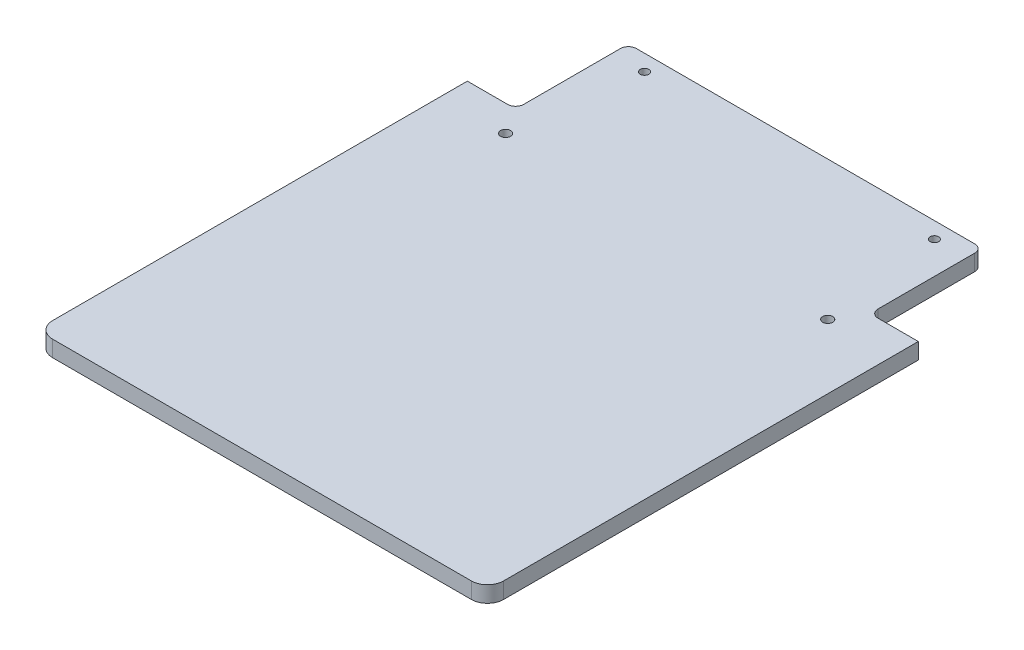
ISO-10303-21;
HEADER;
FILE_DESCRIPTION(('STEP AP214'),'2;1');
FILE_NAME('part.step','',(''),(''),'','','');
FILE_SCHEMA(('AUTOMOTIVE_DESIGN { 1 0 10303 214 1 1 1 1 }'));
ENDSEC;
DATA;
#1=APPLICATION_CONTEXT('core data for automotive mechanical design processes');
#2=APPLICATION_PROTOCOL_DEFINITION('international standard','automotive_design',2000,#1);
#3=PRODUCT_CONTEXT('',#1,'mechanical');
#4=PRODUCT('Part','Part','',(#3));
#5=PRODUCT_RELATED_PRODUCT_CATEGORY('part','',(#4));
#6=PRODUCT_DEFINITION_FORMATION('','',#4);
#7=PRODUCT_DEFINITION_CONTEXT('part definition',#1,'design');
#8=PRODUCT_DEFINITION('design','',#6,#7);
#9=PRODUCT_DEFINITION_SHAPE('','',#8);
#10=(LENGTH_UNIT() NAMED_UNIT(*) SI_UNIT(.MILLI.,.METRE.));
#11=(NAMED_UNIT(*) PLANE_ANGLE_UNIT() SI_UNIT($,.RADIAN.));
#12=(NAMED_UNIT(*) SI_UNIT($,.STERADIAN.) SOLID_ANGLE_UNIT());
#13=UNCERTAINTY_MEASURE_WITH_UNIT(LENGTH_MEASURE(1.E-05),#10,'distance_accuracy_value','');
#14=(GEOMETRIC_REPRESENTATION_CONTEXT(3) GLOBAL_UNCERTAINTY_ASSIGNED_CONTEXT((#13)) GLOBAL_UNIT_ASSIGNED_CONTEXT((#10,
#11,#12)) REPRESENTATION_CONTEXT('',''));
#15=CARTESIAN_POINT('',(0.,0.,0.));
#16=DIRECTION('',(0.,0.,1.));
#17=DIRECTION('',(1.,0.,0.));
#18=AXIS2_PLACEMENT_3D('',#15,#16,#17);
#19=CARTESIAN_POINT('',(0.,12.7,0.));
#20=DIRECTION('',(1.,0.,0.));
#21=DIRECTION('',(0.,0.,-1.));
#22=AXIS2_PLACEMENT_3D('',#19,#20,#21);
#23=PLANE('',#22);
#24=DIRECTION('',(0.,0.,1.));
#25=VECTOR('',#24,1.);
#26=CARTESIAN_POINT('',(0.,12.7,0.));
#27=LINE('',#26,#25);
#28=CARTESIAN_POINT('',(0.,12.7,-339.725));
#29=VERTEX_POINT('',#28);
#30=CARTESIAN_POINT('',(0.,12.7,-12.7));
#31=VERTEX_POINT('',#30);
#32=EDGE_CURVE('E149',#29,#31,#27,.T.);
#33=ORIENTED_EDGE('',*,*,#32,.F.);
#34=DIRECTION('',(0.,1.,0.));
#35=VECTOR('',#34,1.);
#36=CARTESIAN_POINT('',(0.,0.,-339.725));
#37=LINE('',#36,#35);
#38=CARTESIAN_POINT('',(0.,0.,-339.725));
#39=VERTEX_POINT('',#38);
#40=EDGE_CURVE('E137',#39,#29,#37,.T.);
#41=ORIENTED_EDGE('',*,*,#40,.F.);
#42=DIRECTION('',(0.,0.,1.));
#43=VECTOR('',#42,1.);
#44=CARTESIAN_POINT('',(0.,0.,0.));
#45=LINE('',#44,#43);
#46=CARTESIAN_POINT('',(0.,0.,-12.7));
#47=VERTEX_POINT('',#46);
#48=EDGE_CURVE('E147',#39,#47,#45,.T.);
#49=ORIENTED_EDGE('',*,*,#48,.T.);
#50=DIRECTION('',(0.,-1.,0.));
#51=VECTOR('',#50,1.);
#52=CARTESIAN_POINT('',(0.,12.7,-12.7));
#53=LINE('',#52,#51);
#54=EDGE_CURVE('E185',#47,#31,#53,.F.);
#55=ORIENTED_EDGE('',*,*,#54,.T.);
#56=EDGE_LOOP('',(#33,#41,#49,#55));
#57=FACE_BOUND('',#56,.T.);
#58=ADVANCED_FACE('F35',(#57),#23,.F.);
#59=CARTESIAN_POINT('',(0.,12.7,0.));
#60=DIRECTION('',(0.,0.,-1.));
#61=DIRECTION('',(-1.,0.,0.));
#62=AXIS2_PLACEMENT_3D('',#59,#60,#61);
#63=PLANE('',#62);
#64=DIRECTION('',(1.,0.,0.));
#65=VECTOR('',#64,1.);
#66=CARTESIAN_POINT('',(0.,0.,0.));
#67=LINE('',#66,#65);
#68=CARTESIAN_POINT('',(12.7,0.,0.));
#69=VERTEX_POINT('',#68);
#70=CARTESIAN_POINT('',(342.9,0.,0.));
#71=VERTEX_POINT('',#70);
#72=EDGE_CURVE('E156',#69,#71,#67,.T.);
#73=ORIENTED_EDGE('',*,*,#72,.T.);
#74=DIRECTION('',(0.,-1.,0.));
#75=VECTOR('',#74,1.);
#76=CARTESIAN_POINT('',(342.9,12.7,0.));
#77=LINE('',#76,#75);
#78=CARTESIAN_POINT('',(342.9,12.7,0.));
#79=VERTEX_POINT('',#78);
#80=EDGE_CURVE('E179',#71,#79,#77,.F.);
#81=ORIENTED_EDGE('',*,*,#80,.T.);
#82=DIRECTION('',(1.,0.,0.));
#83=VECTOR('',#82,1.);
#84=CARTESIAN_POINT('',(0.,12.7,0.));
#85=LINE('',#84,#83);
#86=CARTESIAN_POINT('',(12.7,12.7,0.));
#87=VERTEX_POINT('',#86);
#88=EDGE_CURVE('E249',#87,#79,#85,.T.);
#89=ORIENTED_EDGE('',*,*,#88,.F.);
#90=DIRECTION('',(0.,-1.,0.));
#91=VECTOR('',#90,1.);
#92=CARTESIAN_POINT('',(12.7,12.7,0.));
#93=LINE('',#92,#91);
#94=EDGE_CURVE('E176',#87,#69,#93,.T.);
#95=ORIENTED_EDGE('',*,*,#94,.T.);
#96=EDGE_LOOP('',(#73,#81,#89,#95));
#97=FACE_BOUND('',#96,.T.);
#98=ADVANCED_FACE('F285',(#97),#63,.F.);
#99=CARTESIAN_POINT('',(355.6,12.7,0.));
#100=DIRECTION('',(-1.,0.,0.));
#101=DIRECTION('',(0.,0.,1.));
#102=AXIS2_PLACEMENT_3D('',#99,#100,#101);
#103=PLANE('',#102);
#104=DIRECTION('',(0.,0.,-1.));
#105=VECTOR('',#104,1.);
#106=CARTESIAN_POINT('',(355.6,0.,0.));
#107=LINE('',#106,#105);
#108=CARTESIAN_POINT('',(355.6,0.,-12.7));
#109=VERTEX_POINT('',#108);
#110=CARTESIAN_POINT('',(355.6,0.,-339.725));
#111=VERTEX_POINT('',#110);
#112=EDGE_CURVE('E159',#109,#111,#107,.T.);
#113=ORIENTED_EDGE('',*,*,#112,.T.);
#114=DIRECTION('',(0.,1.,0.));
#115=VECTOR('',#114,1.);
#116=CARTESIAN_POINT('',(355.6,0.,-339.725));
#117=LINE('',#116,#115);
#118=CARTESIAN_POINT('',(355.6,12.7,-339.725));
#119=VERTEX_POINT('',#118);
#120=EDGE_CURVE('E224',#111,#119,#117,.T.);
#121=ORIENTED_EDGE('',*,*,#120,.T.);
#122=DIRECTION('',(0.,0.,-1.));
#123=VECTOR('',#122,1.);
#124=CARTESIAN_POINT('',(355.6,12.7,0.));
#125=LINE('',#124,#123);
#126=CARTESIAN_POINT('',(355.6,12.7,-12.7));
#127=VERTEX_POINT('',#126);
#128=EDGE_CURVE('E251',#127,#119,#125,.T.);
#129=ORIENTED_EDGE('',*,*,#128,.F.);
#130=DIRECTION('',(0.,-1.,0.));
#131=VECTOR('',#130,1.);
#132=CARTESIAN_POINT('',(355.6,12.7,-12.7));
#133=LINE('',#132,#131);
#134=EDGE_CURVE('E170',#127,#109,#133,.T.);
#135=ORIENTED_EDGE('',*,*,#134,.T.);
#136=EDGE_LOOP('',(#113,#121,#129,#135));
#137=FACE_BOUND('',#136,.T.);
#138=ADVANCED_FACE('F277',(#137),#103,.F.);
#139=CARTESIAN_POINT('',(0.,12.7,-428.625));
#140=DIRECTION('',(0.,0.,1.));
#141=DIRECTION('',(1.,0.,0.));
#142=AXIS2_PLACEMENT_3D('',#139,#140,#141);
#143=PLANE('',#142);
#144=DIRECTION('',(-1.,0.,0.));
#145=VECTOR('',#144,1.);
#146=CARTESIAN_POINT('',(0.,12.7,-428.625));
#147=LINE('',#146,#145);
#148=CARTESIAN_POINT('',(311.15,12.7,-428.625));
#149=VERTEX_POINT('',#148);
#150=CARTESIAN_POINT('',(44.45,12.7,-428.625));
#151=VERTEX_POINT('',#150);
#152=EDGE_CURVE('E162',#149,#151,#147,.T.);
#153=ORIENTED_EDGE('',*,*,#152,.F.);
#154=DIRECTION('',(0.,1.,0.));
#155=VECTOR('',#154,1.);
#156=CARTESIAN_POINT('',(311.15,12.7,-428.625));
#157=LINE('',#156,#155);
#158=CARTESIAN_POINT('',(311.15,0.,-428.625));
#159=VERTEX_POINT('',#158);
#160=EDGE_CURVE('E199',#149,#159,#157,.F.);
#161=ORIENTED_EDGE('',*,*,#160,.T.);
#162=DIRECTION('',(-1.,0.,0.));
#163=VECTOR('',#162,1.);
#164=CARTESIAN_POINT('',(0.,0.,-428.625));
#165=LINE('',#164,#163);
#166=CARTESIAN_POINT('',(44.45,0.,-428.625));
#167=VERTEX_POINT('',#166);
#168=EDGE_CURVE('E167',#159,#167,#165,.T.);
#169=ORIENTED_EDGE('',*,*,#168,.T.);
#170=DIRECTION('',(0.,1.,0.));
#171=VECTOR('',#170,1.);
#172=CARTESIAN_POINT('',(44.45,12.7,-428.625));
#173=LINE('',#172,#171);
#174=EDGE_CURVE('E196',#167,#151,#173,.T.);
#175=ORIENTED_EDGE('',*,*,#174,.T.);
#176=EDGE_LOOP('',(#153,#161,#169,#175));
#177=FACE_BOUND('',#176,.T.);
#178=ADVANCED_FACE('F259',(#177),#143,.F.);
#179=CARTESIAN_POINT('',(0.,12.7,0.));
#180=DIRECTION('',(0.,-1.,0.));
#181=DIRECTION('',(0.,0.,-1.));
#182=AXIS2_PLACEMENT_3D('',#179,#180,#181);
#183=PLANE('',#182);
#184=CARTESIAN_POINT('',(50.8,12.7,-319.0875));
#185=DIRECTION('',(0.,-1.,0.));
#186=DIRECTION('',(0.,0.,-1.));
#187=AXIS2_PLACEMENT_3D('',#184,#185,#186);
#188=CIRCLE('',#187,3.96874999999999);
#189=CARTESIAN_POINT('',(50.8,12.7,-323.05625));
#190=VERTEX_POINT('',#189);
#191=EDGE_CURVE('E342',#190,#190,#188,.T.);
#192=ORIENTED_EDGE('',*,*,#191,.T.);
#193=EDGE_LOOP('',(#192));
#194=FACE_BOUND('',#193,.T.);
#195=CARTESIAN_POINT('',(304.8,12.7,-319.0875));
#196=DIRECTION('',(0.,-1.,0.));
#197=DIRECTION('',(0.,0.,-1.));
#198=AXIS2_PLACEMENT_3D('',#195,#196,#197);
#199=CIRCLE('',#198,3.96875000000002);
#200=CARTESIAN_POINT('',(304.8,12.7,-323.05625));
#201=VERTEX_POINT('',#200);
#202=EDGE_CURVE('E352',#201,#201,#199,.T.);
#203=ORIENTED_EDGE('',*,*,#202,.T.);
#204=EDGE_LOOP('',(#203));
#205=FACE_BOUND('',#204,.T.);
#206=CARTESIAN_POINT('',(63.5,12.7,-415.925));
#207=DIRECTION('',(0.,1.,0.));
#208=DIRECTION('',(0.,0.,1.));
#209=AXIS2_PLACEMENT_3D('',#206,#207,#208);
#210=CIRCLE('',#209,3.3782);
#211=CARTESIAN_POINT('',(63.5,12.7,-412.5468));
#212=VERTEX_POINT('',#211);
#213=EDGE_CURVE('E355',#212,#212,#210,.T.);
#214=ORIENTED_EDGE('',*,*,#213,.F.);
#215=EDGE_LOOP('',(#214));
#216=FACE_BOUND('',#215,.T.);
#217=CARTESIAN_POINT('',(292.1,12.7,-415.925));
#218=DIRECTION('',(0.,1.,0.));
#219=DIRECTION('',(0.,0.,1.));
#220=AXIS2_PLACEMENT_3D('',#217,#218,#219);
#221=CIRCLE('',#220,3.3782);
#222=CARTESIAN_POINT('',(292.1,12.7,-412.5468));
#223=VERTEX_POINT('',#222);
#224=EDGE_CURVE('E361',#223,#223,#221,.T.);
#225=ORIENTED_EDGE('',*,*,#224,.F.);
#226=EDGE_LOOP('',(#225));
#227=FACE_BOUND('',#226,.T.);
#228=DIRECTION('',(0.,0.,1.));
#229=VECTOR('',#228,1.);
#230=CARTESIAN_POINT('',(317.5,12.7,-428.625));
#231=LINE('',#230,#229);
#232=CARTESIAN_POINT('',(317.5,12.7,-422.275));
#233=VERTEX_POINT('',#232);
#234=CARTESIAN_POINT('',(317.5,12.7,-346.075));
#235=VERTEX_POINT('',#234);
#236=EDGE_CURVE('E241',#233,#235,#231,.T.);
#237=ORIENTED_EDGE('',*,*,#236,.F.);
#238=CARTESIAN_POINT('',(311.15,12.7,-422.275));
#239=DIRECTION('',(0.,-1.,0.));
#240=DIRECTION('',(0.,0.,-1.));
#241=AXIS2_PLACEMENT_3D('',#238,#239,#240);
#242=CIRCLE('',#241,6.35);
#243=EDGE_CURVE('E194',#233,#149,#242,.F.);
#244=ORIENTED_EDGE('',*,*,#243,.T.);
#245=ORIENTED_EDGE('',*,*,#152,.T.);
#246=CARTESIAN_POINT('',(44.45,12.7,-422.275));
#247=DIRECTION('',(0.,-1.,0.));
#248=DIRECTION('',(0.,0.,-1.));
#249=AXIS2_PLACEMENT_3D('',#246,#247,#248);
#250=CIRCLE('',#249,6.35);
#251=CARTESIAN_POINT('',(38.1,12.7,-422.275));
#252=VERTEX_POINT('',#251);
#253=EDGE_CURVE('E192',#151,#252,#250,.F.);
#254=ORIENTED_EDGE('',*,*,#253,.T.);
#255=DIRECTION('',(0.,0.,-1.));
#256=VECTOR('',#255,1.);
#257=CARTESIAN_POINT('',(38.1,12.7,-428.625));
#258=LINE('',#257,#256);
#259=CARTESIAN_POINT('',(38.1,12.7,-346.075));
#260=VERTEX_POINT('',#259);
#261=EDGE_CURVE('E142',#260,#252,#258,.T.);
#262=ORIENTED_EDGE('',*,*,#261,.F.);
#263=CARTESIAN_POINT('',(31.75,12.7,-346.075));
#264=DIRECTION('',(0.,-1.,0.));
#265=DIRECTION('',(0.,0.,-1.));
#266=AXIS2_PLACEMENT_3D('',#263,#264,#265);
#267=CIRCLE('',#266,6.35);
#268=CARTESIAN_POINT('',(31.75,12.7,-339.725));
#269=VERTEX_POINT('',#268);
#270=EDGE_CURVE('E43',#260,#269,#267,.T.);
#271=ORIENTED_EDGE('',*,*,#270,.T.);
#272=DIRECTION('',(1.,0.,0.));
#273=VECTOR('',#272,1.);
#274=CARTESIAN_POINT('',(0.,12.7,-339.725));
#275=LINE('',#274,#273);
#276=EDGE_CURVE('E220',#29,#269,#275,.T.);
#277=ORIENTED_EDGE('',*,*,#276,.F.);
#278=ORIENTED_EDGE('',*,*,#32,.T.);
#279=CARTESIAN_POINT('',(12.7,12.7,-12.7));
#280=DIRECTION('',(0.,-1.,0.));
#281=DIRECTION('',(0.,0.,-1.));
#282=AXIS2_PLACEMENT_3D('',#279,#280,#281);
#283=CIRCLE('',#282,12.7);
#284=EDGE_CURVE('E181',#31,#87,#283,.F.);
#285=ORIENTED_EDGE('',*,*,#284,.T.);
#286=ORIENTED_EDGE('',*,*,#88,.T.);
#287=CARTESIAN_POINT('',(342.9,12.7,-12.7));
#288=DIRECTION('',(0.,-1.,0.));
#289=DIRECTION('',(0.,0.,-1.));
#290=AXIS2_PLACEMENT_3D('',#287,#288,#289);
#291=CIRCLE('',#290,12.7);
#292=EDGE_CURVE('E183',#79,#127,#291,.F.);
#293=ORIENTED_EDGE('',*,*,#292,.T.);
#294=ORIENTED_EDGE('',*,*,#128,.T.);
#295=DIRECTION('',(1.,0.,0.));
#296=VECTOR('',#295,1.);
#297=CARTESIAN_POINT('',(355.6,12.7,-339.725));
#298=LINE('',#297,#296);
#299=CARTESIAN_POINT('',(323.85,12.7,-339.725));
#300=VERTEX_POINT('',#299);
#301=EDGE_CURVE('E239',#300,#119,#298,.T.);
#302=ORIENTED_EDGE('',*,*,#301,.F.);
#303=CARTESIAN_POINT('',(323.85,12.7,-346.075));
#304=DIRECTION('',(0.,-1.,0.));
#305=DIRECTION('',(0.,0.,-1.));
#306=AXIS2_PLACEMENT_3D('',#303,#304,#305);
#307=CIRCLE('',#306,6.35);
#308=EDGE_CURVE('E214',#300,#235,#307,.T.);
#309=ORIENTED_EDGE('',*,*,#308,.T.);
#310=EDGE_LOOP('',(#237,#244,#245,#254,#262,#271,#277,#278,#285,#286,#293,#294,#302,#309));
#311=FACE_BOUND('',#310,.T.);
#312=ADVANCED_FACE('F219',(#194,#205,#216,#227,#311),#183,.F.);
#313=CARTESIAN_POINT('',(0.,0.,0.));
#314=DIRECTION('',(0.,-1.,0.));
#315=DIRECTION('',(0.,0.,-1.));
#316=AXIS2_PLACEMENT_3D('',#313,#314,#315);
#317=PLANE('',#316);
#318=CARTESIAN_POINT('',(50.8,0.,-319.0875));
#319=DIRECTION('',(0.,-1.,0.));
#320=DIRECTION('',(0.,0.,-1.));
#321=AXIS2_PLACEMENT_3D('',#318,#319,#320);
#322=CIRCLE('',#321,3.96875);
#323=CARTESIAN_POINT('',(50.8,0.,-323.05625));
#324=VERTEX_POINT('',#323);
#325=EDGE_CURVE('E345',#324,#324,#322,.T.);
#326=ORIENTED_EDGE('',*,*,#325,.F.);
#327=EDGE_LOOP('',(#326));
#328=FACE_BOUND('',#327,.T.);
#329=CARTESIAN_POINT('',(304.8,0.,-319.0875));
#330=DIRECTION('',(0.,-1.,0.));
#331=DIRECTION('',(0.,0.,-1.));
#332=AXIS2_PLACEMENT_3D('',#329,#330,#331);
#333=CIRCLE('',#332,3.96875000000002);
#334=CARTESIAN_POINT('',(304.8,0.,-323.05625));
#335=VERTEX_POINT('',#334);
#336=EDGE_CURVE('E347',#335,#335,#333,.T.);
#337=ORIENTED_EDGE('',*,*,#336,.F.);
#338=EDGE_LOOP('',(#337));
#339=FACE_BOUND('',#338,.T.);
#340=CARTESIAN_POINT('',(63.5,0.,-415.925));
#341=DIRECTION('',(0.,1.,0.));
#342=DIRECTION('',(0.,0.,1.));
#343=AXIS2_PLACEMENT_3D('',#340,#341,#342);
#344=CIRCLE('',#343,3.3782);
#345=CARTESIAN_POINT('',(63.5,0.,-412.5468));
#346=VERTEX_POINT('',#345);
#347=EDGE_CURVE('E358',#346,#346,#344,.T.);
#348=ORIENTED_EDGE('',*,*,#347,.T.);
#349=EDGE_LOOP('',(#348));
#350=FACE_BOUND('',#349,.T.);
#351=CARTESIAN_POINT('',(292.1,0.,-415.925));
#352=DIRECTION('',(0.,1.,0.));
#353=DIRECTION('',(0.,0.,1.));
#354=AXIS2_PLACEMENT_3D('',#351,#352,#353);
#355=CIRCLE('',#354,3.3782);
#356=CARTESIAN_POINT('',(292.1,0.,-412.5468));
#357=VERTEX_POINT('',#356);
#358=EDGE_CURVE('E244',#357,#357,#355,.T.);
#359=ORIENTED_EDGE('',*,*,#358,.T.);
#360=EDGE_LOOP('',(#359));
#361=FACE_BOUND('',#360,.T.);
#362=ORIENTED_EDGE('',*,*,#168,.F.);
#363=CARTESIAN_POINT('',(311.15,0.,-422.275));
#364=DIRECTION('',(0.,-1.,0.));
#365=DIRECTION('',(0.,0.,-1.));
#366=AXIS2_PLACEMENT_3D('',#363,#364,#365);
#367=CIRCLE('',#366,6.35);
#368=CARTESIAN_POINT('',(317.5,0.,-422.275));
#369=VERTEX_POINT('',#368);
#370=EDGE_CURVE('E203',#159,#369,#367,.T.);
#371=ORIENTED_EDGE('',*,*,#370,.T.);
#372=DIRECTION('',(0.,0.,1.));
#373=VECTOR('',#372,1.);
#374=CARTESIAN_POINT('',(317.5,0.,-428.625));
#375=LINE('',#374,#373);
#376=CARTESIAN_POINT('',(317.5,0.,-346.075));
#377=VERTEX_POINT('',#376);
#378=EDGE_CURVE('E236',#369,#377,#375,.T.);
#379=ORIENTED_EDGE('',*,*,#378,.T.);
#380=CARTESIAN_POINT('',(323.85,0.,-346.075));
#381=DIRECTION('',(0.,-1.,0.));
#382=DIRECTION('',(0.,0.,-1.));
#383=AXIS2_PLACEMENT_3D('',#380,#381,#382);
#384=CIRCLE('',#383,6.35);
#385=CARTESIAN_POINT('',(323.85,0.,-339.725));
#386=VERTEX_POINT('',#385);
#387=EDGE_CURVE('E58',#377,#386,#384,.F.);
#388=ORIENTED_EDGE('',*,*,#387,.T.);
#389=DIRECTION('',(1.,0.,0.));
#390=VECTOR('',#389,1.);
#391=CARTESIAN_POINT('',(355.6,0.,-339.725));
#392=LINE('',#391,#390);
#393=EDGE_CURVE('E238',#386,#111,#392,.T.);
#394=ORIENTED_EDGE('',*,*,#393,.T.);
#395=ORIENTED_EDGE('',*,*,#112,.F.);
#396=CARTESIAN_POINT('',(342.9,0.,-12.7));
#397=DIRECTION('',(0.,-1.,0.));
#398=DIRECTION('',(0.,0.,-1.));
#399=AXIS2_PLACEMENT_3D('',#396,#397,#398);
#400=CIRCLE('',#399,12.7);
#401=EDGE_CURVE('E174',#109,#71,#400,.T.);
#402=ORIENTED_EDGE('',*,*,#401,.T.);
#403=ORIENTED_EDGE('',*,*,#72,.F.);
#404=CARTESIAN_POINT('',(12.7,0.,-12.7));
#405=DIRECTION('',(0.,-1.,0.));
#406=DIRECTION('',(0.,0.,-1.));
#407=AXIS2_PLACEMENT_3D('',#404,#405,#406);
#408=CIRCLE('',#407,12.7);
#409=EDGE_CURVE('E154',#69,#47,#408,.T.);
#410=ORIENTED_EDGE('',*,*,#409,.T.);
#411=ORIENTED_EDGE('',*,*,#48,.F.);
#412=DIRECTION('',(1.,0.,0.));
#413=VECTOR('',#412,1.);
#414=CARTESIAN_POINT('',(0.,0.,-339.725));
#415=LINE('',#414,#413);
#416=CARTESIAN_POINT('',(31.75,0.,-339.725));
#417=VERTEX_POINT('',#416);
#418=EDGE_CURVE('E134',#39,#417,#415,.T.);
#419=ORIENTED_EDGE('',*,*,#418,.T.);
#420=CARTESIAN_POINT('',(31.75,0.,-346.075));
#421=DIRECTION('',(0.,-1.,0.));
#422=DIRECTION('',(0.,0.,-1.));
#423=AXIS2_PLACEMENT_3D('',#420,#421,#422);
#424=CIRCLE('',#423,6.35);
#425=CARTESIAN_POINT('',(38.1,0.,-346.075));
#426=VERTEX_POINT('',#425);
#427=EDGE_CURVE('E11',#417,#426,#424,.F.);
#428=ORIENTED_EDGE('',*,*,#427,.T.);
#429=DIRECTION('',(0.,0.,-1.));
#430=VECTOR('',#429,1.);
#431=CARTESIAN_POINT('',(38.1,0.,-428.625));
#432=LINE('',#431,#430);
#433=CARTESIAN_POINT('',(38.1,0.,-422.275));
#434=VERTEX_POINT('',#433);
#435=EDGE_CURVE('E141',#426,#434,#432,.T.);
#436=ORIENTED_EDGE('',*,*,#435,.T.);
#437=CARTESIAN_POINT('',(44.45,0.,-422.275));
#438=DIRECTION('',(0.,-1.,0.));
#439=DIRECTION('',(0.,0.,-1.));
#440=AXIS2_PLACEMENT_3D('',#437,#438,#439);
#441=CIRCLE('',#440,6.35);
#442=EDGE_CURVE('E201',#434,#167,#441,.T.);
#443=ORIENTED_EDGE('',*,*,#442,.T.);
#444=EDGE_LOOP('',(#362,#371,#379,#388,#394,#395,#402,#403,#410,#411,#419,#428,#436,#443));
#445=FACE_BOUND('',#444,.T.);
#446=ADVANCED_FACE('F152',(#328,#339,#350,#361,#445),#317,.T.);
#447=CARTESIAN_POINT('',(342.9,12.7,-12.7));
#448=DIRECTION('',(0.,-1.,0.));
#449=DIRECTION('',(0.,0.,-1.));
#450=AXIS2_PLACEMENT_3D('',#447,#448,#449);
#451=CYLINDRICAL_SURFACE('',#450,12.7);
#452=ORIENTED_EDGE('',*,*,#292,.F.);
#453=ORIENTED_EDGE('',*,*,#80,.F.);
#454=ORIENTED_EDGE('',*,*,#401,.F.);
#455=ORIENTED_EDGE('',*,*,#134,.F.);
#456=EDGE_LOOP('',(#452,#453,#454,#455));
#457=FACE_BOUND('',#456,.T.);
#458=ADVANCED_FACE('F281',(#457),#451,.T.);
#459=CARTESIAN_POINT('',(12.7,12.7,-12.7));
#460=DIRECTION('',(0.,-1.,0.));
#461=DIRECTION('',(0.,0.,-1.));
#462=AXIS2_PLACEMENT_3D('',#459,#460,#461);
#463=CYLINDRICAL_SURFACE('',#462,12.7);
#464=ORIENTED_EDGE('',*,*,#284,.F.);
#465=ORIENTED_EDGE('',*,*,#54,.F.);
#466=ORIENTED_EDGE('',*,*,#409,.F.);
#467=ORIENTED_EDGE('',*,*,#94,.F.);
#468=EDGE_LOOP('',(#464,#465,#466,#467));
#469=FACE_BOUND('',#468,.T.);
#470=ADVANCED_FACE('F289',(#469),#463,.T.);
#471=CARTESIAN_POINT('',(355.6,0.,-339.725));
#472=DIRECTION('',(0.,0.,1.));
#473=DIRECTION('',(1.,0.,0.));
#474=AXIS2_PLACEMENT_3D('',#471,#472,#473);
#475=PLANE('',#474);
#476=ORIENTED_EDGE('',*,*,#393,.F.);
#477=DIRECTION('',(0.,1.,0.));
#478=VECTOR('',#477,1.);
#479=CARTESIAN_POINT('',(323.85,12.7,-339.725));
#480=LINE('',#479,#478);
#481=EDGE_CURVE('E210',#386,#300,#480,.T.);
#482=ORIENTED_EDGE('',*,*,#481,.T.);
#483=ORIENTED_EDGE('',*,*,#301,.T.);
#484=ORIENTED_EDGE('',*,*,#120,.F.);
#485=EDGE_LOOP('',(#476,#482,#483,#484));
#486=FACE_BOUND('',#485,.T.);
#487=ADVANCED_FACE('F273',(#486),#475,.F.);
#488=CARTESIAN_POINT('',(317.5,0.,-428.625));
#489=DIRECTION('',(-1.,0.,0.));
#490=DIRECTION('',(0.,0.,1.));
#491=AXIS2_PLACEMENT_3D('',#488,#489,#490);
#492=PLANE('',#491);
#493=ORIENTED_EDGE('',*,*,#378,.F.);
#494=DIRECTION('',(0.,1.,0.));
#495=VECTOR('',#494,1.);
#496=CARTESIAN_POINT('',(317.5,0.,-422.275));
#497=LINE('',#496,#495);
#498=EDGE_CURVE('E189',#369,#233,#497,.T.);
#499=ORIENTED_EDGE('',*,*,#498,.T.);
#500=ORIENTED_EDGE('',*,*,#236,.T.);
#501=DIRECTION('',(0.,1.,0.));
#502=VECTOR('',#501,1.);
#503=CARTESIAN_POINT('',(317.5,0.,-346.075));
#504=LINE('',#503,#502);
#505=EDGE_CURVE('E187',#235,#377,#504,.F.);
#506=ORIENTED_EDGE('',*,*,#505,.T.);
#507=EDGE_LOOP('',(#493,#499,#500,#506));
#508=FACE_BOUND('',#507,.T.);
#509=ADVANCED_FACE('F267',(#508),#492,.F.);
#510=CARTESIAN_POINT('',(38.1,0.,-428.625));
#511=DIRECTION('',(1.,0.,0.));
#512=DIRECTION('',(0.,0.,-1.));
#513=AXIS2_PLACEMENT_3D('',#510,#511,#512);
#514=PLANE('',#513);
#515=ORIENTED_EDGE('',*,*,#261,.T.);
#516=DIRECTION('',(0.,1.,0.));
#517=VECTOR('',#516,1.);
#518=CARTESIAN_POINT('',(38.1,0.,-422.275));
#519=LINE('',#518,#517);
#520=EDGE_CURVE('E208',#252,#434,#519,.F.);
#521=ORIENTED_EDGE('',*,*,#520,.T.);
#522=ORIENTED_EDGE('',*,*,#435,.F.);
#523=DIRECTION('',(0.,1.,0.));
#524=VECTOR('',#523,1.);
#525=CARTESIAN_POINT('',(38.1,12.7,-346.075));
#526=LINE('',#525,#524);
#527=EDGE_CURVE('E205',#426,#260,#526,.T.);
#528=ORIENTED_EDGE('',*,*,#527,.T.);
#529=EDGE_LOOP('',(#515,#521,#522,#528));
#530=FACE_BOUND('',#529,.T.);
#531=ADVANCED_FACE('F230',(#530),#514,.F.);
#532=CARTESIAN_POINT('',(0.,0.,-339.725));
#533=DIRECTION('',(0.,0.,1.));
#534=DIRECTION('',(1.,0.,0.));
#535=AXIS2_PLACEMENT_3D('',#532,#533,#534);
#536=PLANE('',#535);
#537=ORIENTED_EDGE('',*,*,#276,.T.);
#538=DIRECTION('',(0.,1.,0.));
#539=VECTOR('',#538,1.);
#540=CARTESIAN_POINT('',(31.75,0.,-339.725));
#541=LINE('',#540,#539);
#542=EDGE_CURVE('E50',#269,#417,#541,.F.);
#543=ORIENTED_EDGE('',*,*,#542,.T.);
#544=ORIENTED_EDGE('',*,*,#418,.F.);
#545=ORIENTED_EDGE('',*,*,#40,.T.);
#546=EDGE_LOOP('',(#537,#543,#544,#545));
#547=FACE_BOUND('',#546,.T.);
#548=ADVANCED_FACE('F136',(#547),#536,.F.);
#549=CARTESIAN_POINT('',(311.15,0.,-422.275));
#550=DIRECTION('',(0.,1.,0.));
#551=DIRECTION('',(0.,0.,1.));
#552=AXIS2_PLACEMENT_3D('',#549,#550,#551);
#553=CYLINDRICAL_SURFACE('',#552,6.35);
#554=ORIENTED_EDGE('',*,*,#370,.F.);
#555=ORIENTED_EDGE('',*,*,#160,.F.);
#556=ORIENTED_EDGE('',*,*,#243,.F.);
#557=ORIENTED_EDGE('',*,*,#498,.F.);
#558=EDGE_LOOP('',(#554,#555,#556,#557));
#559=FACE_BOUND('',#558,.T.);
#560=ADVANCED_FACE('F263',(#559),#553,.T.);
#561=CARTESIAN_POINT('',(44.45,12.7,-422.275));
#562=DIRECTION('',(0.,1.,0.));
#563=DIRECTION('',(0.,0.,1.));
#564=AXIS2_PLACEMENT_3D('',#561,#562,#563);
#565=CYLINDRICAL_SURFACE('',#564,6.35);
#566=ORIENTED_EDGE('',*,*,#442,.F.);
#567=ORIENTED_EDGE('',*,*,#520,.F.);
#568=ORIENTED_EDGE('',*,*,#253,.F.);
#569=ORIENTED_EDGE('',*,*,#174,.F.);
#570=EDGE_LOOP('',(#566,#567,#568,#569));
#571=FACE_BOUND('',#570,.T.);
#572=ADVANCED_FACE('F404',(#571),#565,.T.);
#573=CARTESIAN_POINT('',(323.85,0.,-346.075));
#574=DIRECTION('',(0.,-1.,0.));
#575=DIRECTION('',(0.,0.,-1.));
#576=AXIS2_PLACEMENT_3D('',#573,#574,#575);
#577=CYLINDRICAL_SURFACE('',#576,6.35);
#578=ORIENTED_EDGE('',*,*,#387,.F.);
#579=ORIENTED_EDGE('',*,*,#505,.F.);
#580=ORIENTED_EDGE('',*,*,#308,.F.);
#581=ORIENTED_EDGE('',*,*,#481,.F.);
#582=EDGE_LOOP('',(#578,#579,#580,#581));
#583=FACE_BOUND('',#582,.T.);
#584=ADVANCED_FACE('F270',(#583),#577,.F.);
#585=CARTESIAN_POINT('',(31.75,0.,-346.075));
#586=DIRECTION('',(0.,-1.,0.));
#587=DIRECTION('',(0.,0.,-1.));
#588=AXIS2_PLACEMENT_3D('',#585,#586,#587);
#589=CYLINDRICAL_SURFACE('',#588,6.35);
#590=ORIENTED_EDGE('',*,*,#427,.F.);
#591=ORIENTED_EDGE('',*,*,#542,.F.);
#592=ORIENTED_EDGE('',*,*,#270,.F.);
#593=ORIENTED_EDGE('',*,*,#527,.F.);
#594=EDGE_LOOP('',(#590,#591,#592,#593));
#595=FACE_BOUND('',#594,.T.);
#596=ADVANCED_FACE('F37',(#595),#589,.F.);
#597=CARTESIAN_POINT('',(292.1,12.7,-415.925));
#598=DIRECTION('',(0.,1.,0.));
#599=DIRECTION('',(0.,0.,1.));
#600=AXIS2_PLACEMENT_3D('',#597,#598,#599);
#601=CYLINDRICAL_SURFACE('',#600,3.3782);
#602=ORIENTED_EDGE('',*,*,#358,.F.);
#603=EDGE_LOOP('',(#602));
#604=FACE_BOUND('',#603,.T.);
#605=ORIENTED_EDGE('',*,*,#224,.T.);
#606=EDGE_LOOP('',(#605));
#607=FACE_BOUND('',#606,.T.);
#608=ADVANCED_FACE('F322',(#604,#607),#601,.F.);
#609=CARTESIAN_POINT('',(63.5,12.7,-415.925));
#610=DIRECTION('',(0.,1.,0.));
#611=DIRECTION('',(0.,0.,1.));
#612=AXIS2_PLACEMENT_3D('',#609,#610,#611);
#613=CYLINDRICAL_SURFACE('',#612,3.3782);
#614=ORIENTED_EDGE('',*,*,#347,.F.);
#615=EDGE_LOOP('',(#614));
#616=FACE_BOUND('',#615,.T.);
#617=ORIENTED_EDGE('',*,*,#213,.T.);
#618=EDGE_LOOP('',(#617));
#619=FACE_BOUND('',#618,.T.);
#620=ADVANCED_FACE('F325',(#616,#619),#613,.F.);
#621=CARTESIAN_POINT('',(304.8,0.,-319.0875));
#622=DIRECTION('',(0.,-1.,0.));
#623=DIRECTION('',(0.,0.,-1.));
#624=AXIS2_PLACEMENT_3D('',#621,#622,#623);
#625=CYLINDRICAL_SURFACE('',#624,3.96875000000002);
#626=ORIENTED_EDGE('',*,*,#202,.F.);
#627=EDGE_LOOP('',(#626));
#628=FACE_BOUND('',#627,.T.);
#629=ORIENTED_EDGE('',*,*,#336,.T.);
#630=EDGE_LOOP('',(#629));
#631=FACE_BOUND('',#630,.T.);
#632=ADVANCED_FACE('F329',(#628,#631),#625,.F.);
#633=CARTESIAN_POINT('',(50.8,0.,-319.0875));
#634=DIRECTION('',(0.,-1.,0.));
#635=DIRECTION('',(0.,0.,-1.));
#636=AXIS2_PLACEMENT_3D('',#633,#634,#635);
#637=CYLINDRICAL_SURFACE('',#636,3.96875);
#638=ORIENTED_EDGE('',*,*,#191,.F.);
#639=EDGE_LOOP('',(#638));
#640=FACE_BOUND('',#639,.T.);
#641=ORIENTED_EDGE('',*,*,#325,.T.);
#642=EDGE_LOOP('',(#641));
#643=FACE_BOUND('',#642,.T.);
#644=ADVANCED_FACE('F333',(#640,#643),#637,.F.);
#645=CLOSED_SHELL('',(#58,#98,#138,#178,#312,#446,#458,#470,#487,#509,#531,#548,#560,#572,#584,
#596,#608,#620,#632,#644));
#646=MANIFOLD_SOLID_BREP('B2',#645);
#647=ADVANCED_BREP_SHAPE_REPRESENTATION('',(#18,#646),#14);
#648=SHAPE_DEFINITION_REPRESENTATION(#9,#647);
ENDSEC;
END-ISO-10303-21;
